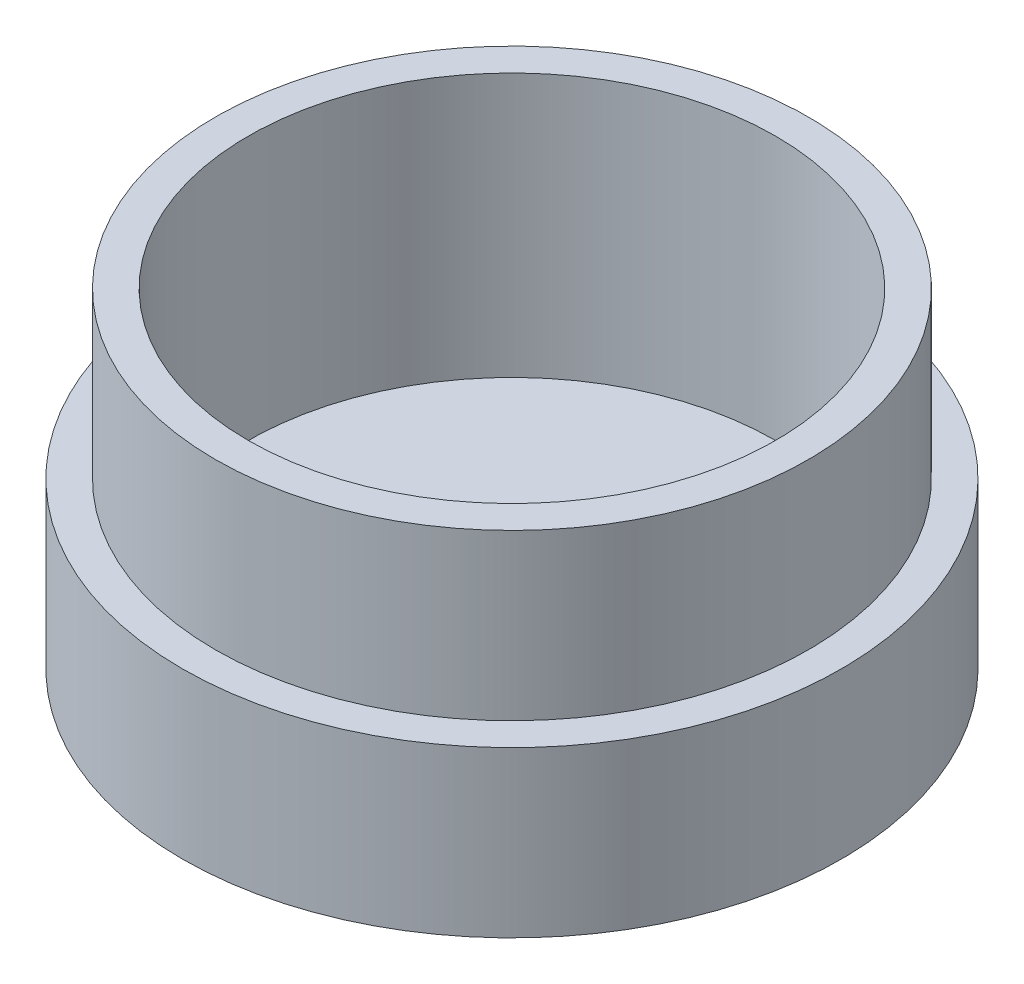
ISO-10303-21;
HEADER;
FILE_DESCRIPTION(('STEP AP214'),'2;1');
FILE_NAME('part.step','',(''),(''),'','','');
FILE_SCHEMA(('AUTOMOTIVE_DESIGN { 1 0 10303 214 1 1 1 1 }'));
ENDSEC;
DATA;
#1=APPLICATION_CONTEXT('core data for automotive mechanical design processes');
#2=APPLICATION_PROTOCOL_DEFINITION('international standard','automotive_design',2000,#1);
#3=PRODUCT_CONTEXT('',#1,'mechanical');
#4=PRODUCT('Part','Part','',(#3));
#5=PRODUCT_RELATED_PRODUCT_CATEGORY('part','',(#4));
#6=PRODUCT_DEFINITION_FORMATION('','',#4);
#7=PRODUCT_DEFINITION_CONTEXT('part definition',#1,'design');
#8=PRODUCT_DEFINITION('design','',#6,#7);
#9=PRODUCT_DEFINITION_SHAPE('','',#8);
#10=(LENGTH_UNIT() NAMED_UNIT(*) SI_UNIT(.MILLI.,.METRE.));
#11=(NAMED_UNIT(*) PLANE_ANGLE_UNIT() SI_UNIT($,.RADIAN.));
#12=(NAMED_UNIT(*) SI_UNIT($,.STERADIAN.) SOLID_ANGLE_UNIT());
#13=UNCERTAINTY_MEASURE_WITH_UNIT(LENGTH_MEASURE(1.E-05),#10,'distance_accuracy_value','');
#14=(GEOMETRIC_REPRESENTATION_CONTEXT(3) GLOBAL_UNCERTAINTY_ASSIGNED_CONTEXT((#13)) GLOBAL_UNIT_ASSIGNED_CONTEXT((#10,
#11,#12)) REPRESENTATION_CONTEXT('',''));
#15=CARTESIAN_POINT('',(0.,0.,0.));
#16=DIRECTION('',(0.,0.,1.));
#17=DIRECTION('',(1.,0.,0.));
#18=AXIS2_PLACEMENT_3D('',#15,#16,#17);
#19=CARTESIAN_POINT('',(0.,25.4,0.));
#20=DIRECTION('',(0.,1.,0.));
#21=DIRECTION('',(0.,0.,1.));
#22=AXIS2_PLACEMENT_3D('',#19,#20,#21);
#23=PLANE('',#22);
#24=CARTESIAN_POINT('',(0.,25.4,0.));
#25=DIRECTION('',(0.,1.,0.));
#26=DIRECTION('',(0.,0.,1.));
#27=AXIS2_PLACEMENT_3D('',#24,#25,#26);
#28=CIRCLE('',#27,20.32);
#29=CARTESIAN_POINT('',(0.,25.4,20.32));
#30=VERTEX_POINT('',#29);
#31=EDGE_CURVE('E51',#30,#30,#28,.T.);
#32=ORIENTED_EDGE('',*,*,#31,.F.);
#33=EDGE_LOOP('',(#32));
#34=FACE_BOUND('',#33,.T.);
#35=CARTESIAN_POINT('',(0.,25.4,0.));
#36=DIRECTION('',(0.,1.,0.));
#37=DIRECTION('',(0.,0.,1.));
#38=AXIS2_PLACEMENT_3D('',#35,#36,#37);
#39=CIRCLE('',#38,22.86);
#40=CARTESIAN_POINT('',(0.,25.4,22.86));
#41=VERTEX_POINT('',#40);
#42=EDGE_CURVE('E68',#41,#41,#39,.T.);
#43=ORIENTED_EDGE('',*,*,#42,.T.);
#44=EDGE_LOOP('',(#43));
#45=FACE_BOUND('',#44,.T.);
#46=ADVANCED_FACE('F43',(#34,#45),#23,.T.);
#47=CARTESIAN_POINT('',(0.,25.4,0.));
#48=DIRECTION('',(0.,-1.,0.));
#49=DIRECTION('',(0.,0.,-1.));
#50=AXIS2_PLACEMENT_3D('',#47,#48,#49);
#51=CYLINDRICAL_SURFACE('',#50,20.32);
#52=ORIENTED_EDGE('',*,*,#31,.T.);
#53=EDGE_LOOP('',(#52));
#54=FACE_BOUND('',#53,.T.);
#55=CARTESIAN_POINT('',(0.,5.08,0.));
#56=DIRECTION('',(0.,1.,0.));
#57=DIRECTION('',(0.,0.,1.));
#58=AXIS2_PLACEMENT_3D('',#55,#56,#57);
#59=CIRCLE('',#58,20.32);
#60=CARTESIAN_POINT('',(0.,5.08,20.32));
#61=VERTEX_POINT('',#60);
#62=EDGE_CURVE('E56',#61,#61,#59,.T.);
#63=ORIENTED_EDGE('',*,*,#62,.F.);
#64=EDGE_LOOP('',(#63));
#65=FACE_BOUND('',#64,.T.);
#66=ADVANCED_FACE('F93',(#54,#65),#51,.F.);
#67=CARTESIAN_POINT('',(0.,5.08,0.));
#68=DIRECTION('',(0.,1.,0.));
#69=DIRECTION('',(0.,0.,1.));
#70=AXIS2_PLACEMENT_3D('',#67,#68,#69);
#71=PLANE('',#70);
#72=ORIENTED_EDGE('',*,*,#62,.T.);
#73=EDGE_LOOP('',(#72));
#74=FACE_BOUND('',#73,.T.);
#75=ADVANCED_FACE('F82',(#74),#71,.T.);
#76=CARTESIAN_POINT('',(0.,12.7,0.));
#77=DIRECTION('',(0.,1.,0.));
#78=DIRECTION('',(0.,0.,1.));
#79=AXIS2_PLACEMENT_3D('',#76,#77,#78);
#80=PLANE('',#79);
#81=CARTESIAN_POINT('',(0.,12.7,0.));
#82=DIRECTION('',(0.,1.,0.));
#83=DIRECTION('',(0.,0.,1.));
#84=AXIS2_PLACEMENT_3D('',#81,#82,#83);
#85=CIRCLE('',#84,22.86);
#86=CARTESIAN_POINT('',(0.,12.7,22.86));
#87=VERTEX_POINT('',#86);
#88=EDGE_CURVE('E67',#87,#87,#85,.T.);
#89=ORIENTED_EDGE('',*,*,#88,.F.);
#90=EDGE_LOOP('',(#89));
#91=FACE_BOUND('',#90,.T.);
#92=CARTESIAN_POINT('',(0.,12.7,0.));
#93=DIRECTION('',(0.,1.,0.));
#94=DIRECTION('',(0.,0.,1.));
#95=AXIS2_PLACEMENT_3D('',#92,#93,#94);
#96=CIRCLE('',#95,25.4);
#97=CARTESIAN_POINT('',(0.,12.7,25.4));
#98=VERTEX_POINT('',#97);
#99=EDGE_CURVE('E61',#98,#98,#96,.T.);
#100=ORIENTED_EDGE('',*,*,#99,.T.);
#101=EDGE_LOOP('',(#100));
#102=FACE_BOUND('',#101,.T.);
#103=ADVANCED_FACE('F79',(#91,#102),#80,.T.);
#104=CARTESIAN_POINT('',(0.,12.7,0.));
#105=DIRECTION('',(0.,1.,0.));
#106=DIRECTION('',(0.,0.,1.));
#107=AXIS2_PLACEMENT_3D('',#104,#105,#106);
#108=CYLINDRICAL_SURFACE('',#107,22.86);
#109=ORIENTED_EDGE('',*,*,#88,.T.);
#110=EDGE_LOOP('',(#109));
#111=FACE_BOUND('',#110,.T.);
#112=ORIENTED_EDGE('',*,*,#42,.F.);
#113=EDGE_LOOP('',(#112));
#114=FACE_BOUND('',#113,.T.);
#115=ADVANCED_FACE('F76',(#111,#114),#108,.T.);
#116=CARTESIAN_POINT('',(0.,0.,0.));
#117=DIRECTION('',(0.,1.,0.));
#118=DIRECTION('',(0.,0.,1.));
#119=AXIS2_PLACEMENT_3D('',#116,#117,#118);
#120=PLANE('',#119);
#121=CARTESIAN_POINT('',(0.,0.,0.));
#122=DIRECTION('',(0.,1.,0.));
#123=DIRECTION('',(0.,0.,1.));
#124=AXIS2_PLACEMENT_3D('',#121,#122,#123);
#125=CIRCLE('',#124,25.4);
#126=CARTESIAN_POINT('',(0.,0.,25.4));
#127=VERTEX_POINT('',#126);
#128=EDGE_CURVE('E11',#127,#127,#125,.T.);
#129=ORIENTED_EDGE('',*,*,#128,.F.);
#130=EDGE_LOOP('',(#129));
#131=FACE_BOUND('',#130,.T.);
#132=ADVANCED_FACE('F87',(#131),#120,.F.);
#133=CARTESIAN_POINT('',(0.,25.4,0.));
#134=DIRECTION('',(0.,-1.,0.));
#135=DIRECTION('',(0.,0.,-1.));
#136=AXIS2_PLACEMENT_3D('',#133,#134,#135);
#137=CYLINDRICAL_SURFACE('',#136,25.4);
#138=ORIENTED_EDGE('',*,*,#128,.T.);
#139=EDGE_LOOP('',(#138));
#140=FACE_BOUND('',#139,.T.);
#141=ORIENTED_EDGE('',*,*,#99,.F.);
#142=EDGE_LOOP('',(#141));
#143=FACE_BOUND('',#142,.T.);
#144=ADVANCED_FACE('F45',(#140,#143),#137,.T.);
#145=CLOSED_SHELL('',(#46,#66,#75,#103,#115,#132,#144));
#146=MANIFOLD_SOLID_BREP('B2',#145);
#147=ADVANCED_BREP_SHAPE_REPRESENTATION('',(#18,#146),#14);
#148=SHAPE_DEFINITION_REPRESENTATION(#9,#147);
ENDSEC;
END-ISO-10303-21;
